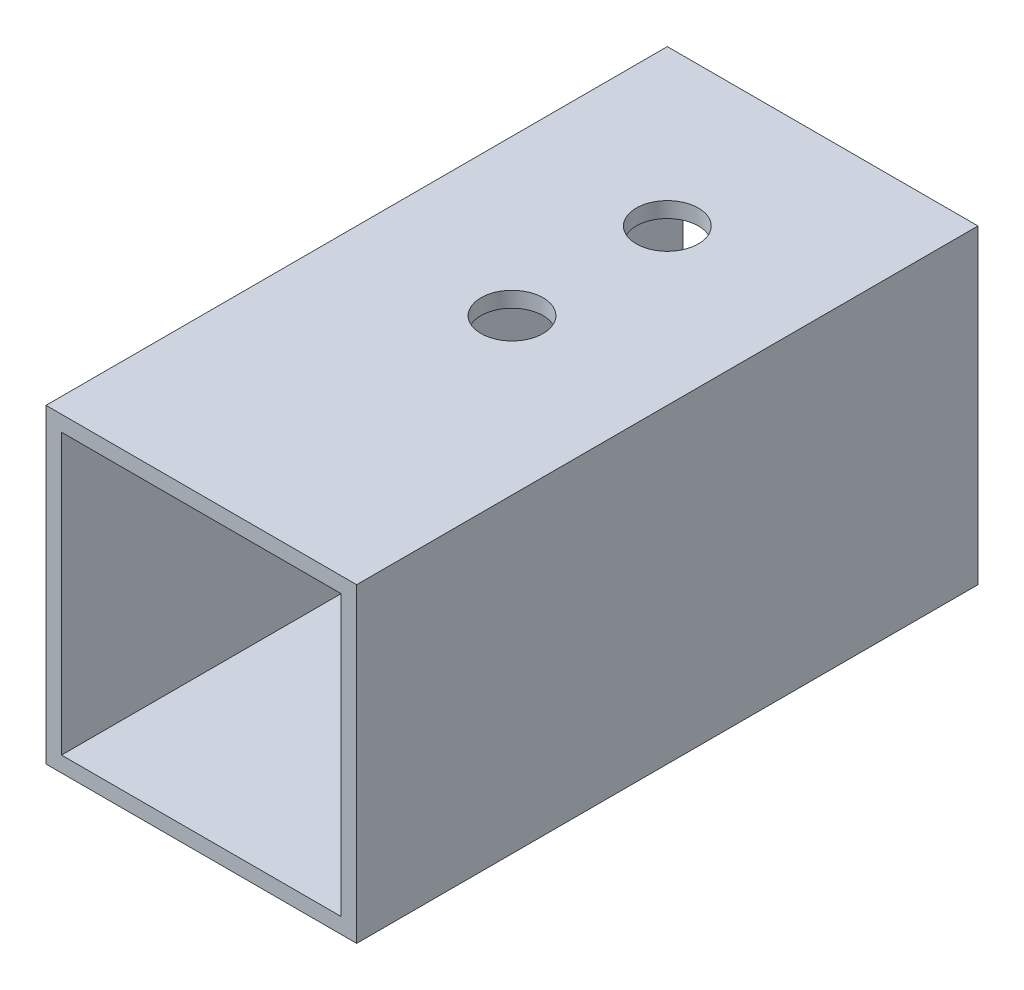
ISO-10303-21;
HEADER;
FILE_DESCRIPTION(('STEP AP214'),'2;1');
FILE_NAME('part.step','',(''),(''),'','','');
FILE_SCHEMA(('AUTOMOTIVE_DESIGN { 1 0 10303 214 1 1 1 1 }'));
ENDSEC;
DATA;
#1=APPLICATION_CONTEXT('core data for automotive mechanical design processes');
#2=APPLICATION_PROTOCOL_DEFINITION('international standard','automotive_design',2000,#1);
#3=PRODUCT_CONTEXT('',#1,'mechanical');
#4=PRODUCT('Part','Part','',(#3));
#5=PRODUCT_RELATED_PRODUCT_CATEGORY('part','',(#4));
#6=PRODUCT_DEFINITION_FORMATION('','',#4);
#7=PRODUCT_DEFINITION_CONTEXT('part definition',#1,'design');
#8=PRODUCT_DEFINITION('design','',#6,#7);
#9=PRODUCT_DEFINITION_SHAPE('','',#8);
#10=(LENGTH_UNIT() NAMED_UNIT(*) SI_UNIT(.MILLI.,.METRE.));
#11=(NAMED_UNIT(*) PLANE_ANGLE_UNIT() SI_UNIT($,.RADIAN.));
#12=(NAMED_UNIT(*) SI_UNIT($,.STERADIAN.) SOLID_ANGLE_UNIT());
#13=UNCERTAINTY_MEASURE_WITH_UNIT(LENGTH_MEASURE(1.E-05),#10,'distance_accuracy_value','');
#14=(GEOMETRIC_REPRESENTATION_CONTEXT(3) GLOBAL_UNCERTAINTY_ASSIGNED_CONTEXT((#13)) GLOBAL_UNIT_ASSIGNED_CONTEXT((#10,
#11,#12)) REPRESENTATION_CONTEXT('',''));
#15=CARTESIAN_POINT('',(0.,0.,0.));
#16=DIRECTION('',(0.,0.,1.));
#17=DIRECTION('',(1.,0.,0.));
#18=AXIS2_PLACEMENT_3D('',#15,#16,#17);
#19=CARTESIAN_POINT('',(0.,0.,80.));
#20=DIRECTION('',(0.,0.,-1.));
#21=DIRECTION('',(-1.,0.,0.));
#22=AXIS2_PLACEMENT_3D('',#19,#20,#21);
#23=PLANE('',#22);
#24=DIRECTION('',(0.,1.,0.));
#25=VECTOR('',#24,1.);
#26=CARTESIAN_POINT('',(20.,-20.,80.));
#27=LINE('',#26,#25);
#28=CARTESIAN_POINT('',(20.,-20.,80.));
#29=VERTEX_POINT('',#28);
#30=CARTESIAN_POINT('',(20.,20.,80.));
#31=VERTEX_POINT('',#30);
#32=EDGE_CURVE('E136',#29,#31,#27,.T.);
#33=ORIENTED_EDGE('',*,*,#32,.T.);
#34=DIRECTION('',(-1.,0.,0.));
#35=VECTOR('',#34,1.);
#36=CARTESIAN_POINT('',(-20.,20.,80.));
#37=LINE('',#36,#35);
#38=CARTESIAN_POINT('',(-20.,20.,80.));
#39=VERTEX_POINT('',#38);
#40=EDGE_CURVE('E139',#31,#39,#37,.T.);
#41=ORIENTED_EDGE('',*,*,#40,.T.);
#42=DIRECTION('',(0.,-1.,0.));
#43=VECTOR('',#42,1.);
#44=CARTESIAN_POINT('',(-20.,-20.,80.));
#45=LINE('',#44,#43);
#46=CARTESIAN_POINT('',(-20.,-20.,80.));
#47=VERTEX_POINT('',#46);
#48=EDGE_CURVE('E142',#39,#47,#45,.T.);
#49=ORIENTED_EDGE('',*,*,#48,.T.);
#50=DIRECTION('',(1.,0.,0.));
#51=VECTOR('',#50,1.);
#52=CARTESIAN_POINT('',(-20.,-20.,80.));
#53=LINE('',#52,#51);
#54=EDGE_CURVE('E144',#47,#29,#53,.T.);
#55=ORIENTED_EDGE('',*,*,#54,.T.);
#56=EDGE_LOOP('',(#33,#41,#49,#55));
#57=FACE_BOUND('',#56,.T.);
#58=DIRECTION('',(0.,1.,0.));
#59=VECTOR('',#58,1.);
#60=CARTESIAN_POINT('',(18.,-18.,80.));
#61=LINE('',#60,#59);
#62=CARTESIAN_POINT('',(18.,-18.,80.));
#63=VERTEX_POINT('',#62);
#64=CARTESIAN_POINT('',(18.,18.,80.));
#65=VERTEX_POINT('',#64);
#66=EDGE_CURVE('E98',#63,#65,#61,.T.);
#67=ORIENTED_EDGE('',*,*,#66,.F.);
#68=DIRECTION('',(1.,0.,0.));
#69=VECTOR('',#68,1.);
#70=CARTESIAN_POINT('',(-18.,-18.,80.));
#71=LINE('',#70,#69);
#72=CARTESIAN_POINT('',(-18.,-18.,80.));
#73=VERTEX_POINT('',#72);
#74=EDGE_CURVE('E120',#73,#63,#71,.T.);
#75=ORIENTED_EDGE('',*,*,#74,.F.);
#76=DIRECTION('',(0.,-1.,0.));
#77=VECTOR('',#76,1.);
#78=CARTESIAN_POINT('',(-18.,-18.,80.));
#79=LINE('',#78,#77);
#80=CARTESIAN_POINT('',(-18.,18.,80.));
#81=VERTEX_POINT('',#80);
#82=EDGE_CURVE('E118',#81,#73,#79,.T.);
#83=ORIENTED_EDGE('',*,*,#82,.F.);
#84=DIRECTION('',(-1.,0.,0.));
#85=VECTOR('',#84,1.);
#86=CARTESIAN_POINT('',(-18.,18.,80.));
#87=LINE('',#86,#85);
#88=EDGE_CURVE('E106',#65,#81,#87,.T.);
#89=ORIENTED_EDGE('',*,*,#88,.F.);
#90=EDGE_LOOP('',(#67,#75,#83,#89));
#91=FACE_BOUND('',#90,.T.);
#92=ADVANCED_FACE('F33',(#57,#91),#23,.F.);
#93=CARTESIAN_POINT('',(0.,0.,0.));
#94=DIRECTION('',(0.,0.,-1.));
#95=DIRECTION('',(-1.,0.,0.));
#96=AXIS2_PLACEMENT_3D('',#93,#94,#95);
#97=PLANE('',#96);
#98=DIRECTION('',(0.,1.,0.));
#99=VECTOR('',#98,1.);
#100=CARTESIAN_POINT('',(20.,-20.,0.));
#101=LINE('',#100,#99);
#102=CARTESIAN_POINT('',(20.,-20.,0.));
#103=VERTEX_POINT('',#102);
#104=CARTESIAN_POINT('',(20.,20.,0.));
#105=VERTEX_POINT('',#104);
#106=EDGE_CURVE('E114',#103,#105,#101,.T.);
#107=ORIENTED_EDGE('',*,*,#106,.F.);
#108=DIRECTION('',(1.,0.,0.));
#109=VECTOR('',#108,1.);
#110=CARTESIAN_POINT('',(-20.,-20.,0.));
#111=LINE('',#110,#109);
#112=CARTESIAN_POINT('',(-20.,-20.,0.));
#113=VERTEX_POINT('',#112);
#114=EDGE_CURVE('E140',#113,#103,#111,.T.);
#115=ORIENTED_EDGE('',*,*,#114,.F.);
#116=DIRECTION('',(0.,-1.,0.));
#117=VECTOR('',#116,1.);
#118=CARTESIAN_POINT('',(-20.,-20.,0.));
#119=LINE('',#118,#117);
#120=CARTESIAN_POINT('',(-20.,20.,0.));
#121=VERTEX_POINT('',#120);
#122=EDGE_CURVE('E151',#121,#113,#119,.T.);
#123=ORIENTED_EDGE('',*,*,#122,.F.);
#124=DIRECTION('',(-1.,0.,0.));
#125=VECTOR('',#124,1.);
#126=CARTESIAN_POINT('',(-20.,20.,0.));
#127=LINE('',#126,#125);
#128=EDGE_CURVE('E149',#105,#121,#127,.T.);
#129=ORIENTED_EDGE('',*,*,#128,.F.);
#130=EDGE_LOOP('',(#107,#115,#123,#129));
#131=FACE_BOUND('',#130,.T.);
#132=DIRECTION('',(1.,0.,0.));
#133=VECTOR('',#132,1.);
#134=CARTESIAN_POINT('',(-18.,-18.,0.));
#135=LINE('',#134,#133);
#136=CARTESIAN_POINT('',(-18.,-18.,0.));
#137=VERTEX_POINT('',#136);
#138=CARTESIAN_POINT('',(18.,-18.,0.));
#139=VERTEX_POINT('',#138);
#140=EDGE_CURVE('E107',#137,#139,#135,.T.);
#141=ORIENTED_EDGE('',*,*,#140,.T.);
#142=DIRECTION('',(0.,1.,0.));
#143=VECTOR('',#142,1.);
#144=CARTESIAN_POINT('',(18.,-18.,0.));
#145=LINE('',#144,#143);
#146=CARTESIAN_POINT('',(18.,18.,0.));
#147=VERTEX_POINT('',#146);
#148=EDGE_CURVE('E56',#139,#147,#145,.T.);
#149=ORIENTED_EDGE('',*,*,#148,.T.);
#150=DIRECTION('',(-1.,0.,0.));
#151=VECTOR('',#150,1.);
#152=CARTESIAN_POINT('',(-18.,18.,0.));
#153=LINE('',#152,#151);
#154=CARTESIAN_POINT('',(-18.,18.,0.));
#155=VERTEX_POINT('',#154);
#156=EDGE_CURVE('E113',#147,#155,#153,.T.);
#157=ORIENTED_EDGE('',*,*,#156,.T.);
#158=DIRECTION('',(0.,-1.,0.));
#159=VECTOR('',#158,1.);
#160=CARTESIAN_POINT('',(-18.,-18.,0.));
#161=LINE('',#160,#159);
#162=EDGE_CURVE('E128',#155,#137,#161,.T.);
#163=ORIENTED_EDGE('',*,*,#162,.T.);
#164=EDGE_LOOP('',(#141,#149,#157,#163));
#165=FACE_BOUND('',#164,.T.);
#166=ADVANCED_FACE('F169',(#131,#165),#97,.T.);
#167=CARTESIAN_POINT('',(20.,-20.,80.));
#168=DIRECTION('',(-1.,0.,0.));
#169=DIRECTION('',(0.,0.,1.));
#170=AXIS2_PLACEMENT_3D('',#167,#168,#169);
#171=PLANE('',#170);
#172=ORIENTED_EDGE('',*,*,#106,.T.);
#173=DIRECTION('',(0.,0.,-1.));
#174=VECTOR('',#173,1.);
#175=CARTESIAN_POINT('',(20.,20.,80.));
#176=LINE('',#175,#174);
#177=EDGE_CURVE('E11',#31,#105,#176,.T.);
#178=ORIENTED_EDGE('',*,*,#177,.F.);
#179=ORIENTED_EDGE('',*,*,#32,.F.);
#180=DIRECTION('',(0.,0.,-1.));
#181=VECTOR('',#180,1.);
#182=CARTESIAN_POINT('',(20.,-20.,80.));
#183=LINE('',#182,#181);
#184=EDGE_CURVE('E146',#29,#103,#183,.T.);
#185=ORIENTED_EDGE('',*,*,#184,.T.);
#186=EDGE_LOOP('',(#172,#178,#179,#185));
#187=FACE_BOUND('',#186,.T.);
#188=ADVANCED_FACE('F35',(#187),#171,.F.);
#189=CARTESIAN_POINT('',(-20.,20.,80.));
#190=DIRECTION('',(0.,-1.,0.));
#191=DIRECTION('',(0.,0.,-1.));
#192=AXIS2_PLACEMENT_3D('',#189,#190,#191);
#193=PLANE('',#192);
#194=CARTESIAN_POINT('',(0.,20.,20.));
#195=DIRECTION('',(0.,1.,0.));
#196=DIRECTION('',(0.,0.,1.));
#197=AXIS2_PLACEMENT_3D('',#194,#195,#196);
#198=CIRCLE('',#197,4.);
#199=CARTESIAN_POINT('',(0.,20.,24.));
#200=VERTEX_POINT('',#199);
#201=EDGE_CURVE('E126',#200,#200,#198,.T.);
#202=ORIENTED_EDGE('',*,*,#201,.F.);
#203=EDGE_LOOP('',(#202));
#204=FACE_BOUND('',#203,.T.);
#205=CARTESIAN_POINT('',(0.,20.,40.));
#206=DIRECTION('',(0.,1.,0.));
#207=DIRECTION('',(0.,0.,1.));
#208=AXIS2_PLACEMENT_3D('',#205,#206,#207);
#209=CIRCLE('',#208,4.);
#210=CARTESIAN_POINT('',(0.,20.,44.));
#211=VERTEX_POINT('',#210);
#212=EDGE_CURVE('E211',#211,#211,#209,.T.);
#213=ORIENTED_EDGE('',*,*,#212,.F.);
#214=EDGE_LOOP('',(#213));
#215=FACE_BOUND('',#214,.T.);
#216=ORIENTED_EDGE('',*,*,#128,.T.);
#217=DIRECTION('',(0.,0.,-1.));
#218=VECTOR('',#217,1.);
#219=CARTESIAN_POINT('',(-20.,20.,80.));
#220=LINE('',#219,#218);
#221=EDGE_CURVE('E41',#39,#121,#220,.T.);
#222=ORIENTED_EDGE('',*,*,#221,.F.);
#223=ORIENTED_EDGE('',*,*,#40,.F.);
#224=ORIENTED_EDGE('',*,*,#177,.T.);
#225=EDGE_LOOP('',(#216,#222,#223,#224));
#226=FACE_BOUND('',#225,.T.);
#227=ADVANCED_FACE('F179',(#204,#215,#226),#193,.F.);
#228=CARTESIAN_POINT('',(-20.,-20.,80.));
#229=DIRECTION('',(1.,0.,0.));
#230=DIRECTION('',(0.,0.,-1.));
#231=AXIS2_PLACEMENT_3D('',#228,#229,#230);
#232=PLANE('',#231);
#233=ORIENTED_EDGE('',*,*,#122,.T.);
#234=DIRECTION('',(0.,0.,-1.));
#235=VECTOR('',#234,1.);
#236=CARTESIAN_POINT('',(-20.,-20.,80.));
#237=LINE('',#236,#235);
#238=EDGE_CURVE('E156',#47,#113,#237,.T.);
#239=ORIENTED_EDGE('',*,*,#238,.F.);
#240=ORIENTED_EDGE('',*,*,#48,.F.);
#241=ORIENTED_EDGE('',*,*,#221,.T.);
#242=EDGE_LOOP('',(#233,#239,#240,#241));
#243=FACE_BOUND('',#242,.T.);
#244=ADVANCED_FACE('F163',(#243),#232,.F.);
#245=CARTESIAN_POINT('',(-20.,-20.,80.));
#246=DIRECTION('',(0.,1.,0.));
#247=DIRECTION('',(0.,0.,1.));
#248=AXIS2_PLACEMENT_3D('',#245,#246,#247);
#249=PLANE('',#248);
#250=CARTESIAN_POINT('',(0.,-20.,20.));
#251=DIRECTION('',(0.,-1.,0.));
#252=DIRECTION('',(0.,0.,-1.));
#253=AXIS2_PLACEMENT_3D('',#250,#251,#252);
#254=CIRCLE('',#253,4.);
#255=CARTESIAN_POINT('',(0.,-20.,16.));
#256=VERTEX_POINT('',#255);
#257=EDGE_CURVE('E205',#256,#256,#254,.T.);
#258=ORIENTED_EDGE('',*,*,#257,.F.);
#259=EDGE_LOOP('',(#258));
#260=FACE_BOUND('',#259,.T.);
#261=ORIENTED_EDGE('',*,*,#114,.T.);
#262=ORIENTED_EDGE('',*,*,#184,.F.);
#263=ORIENTED_EDGE('',*,*,#54,.F.);
#264=ORIENTED_EDGE('',*,*,#238,.T.);
#265=EDGE_LOOP('',(#261,#262,#263,#264));
#266=FACE_BOUND('',#265,.T.);
#267=ADVANCED_FACE('F173',(#260,#266),#249,.F.);
#268=CARTESIAN_POINT('',(18.,-18.,80.));
#269=DIRECTION('',(-1.,0.,0.));
#270=DIRECTION('',(0.,0.,1.));
#271=AXIS2_PLACEMENT_3D('',#268,#269,#270);
#272=PLANE('',#271);
#273=ORIENTED_EDGE('',*,*,#148,.F.);
#274=DIRECTION('',(0.,0.,-1.));
#275=VECTOR('',#274,1.);
#276=CARTESIAN_POINT('',(18.,-18.,80.));
#277=LINE('',#276,#275);
#278=EDGE_CURVE('E102',#63,#139,#277,.T.);
#279=ORIENTED_EDGE('',*,*,#278,.F.);
#280=ORIENTED_EDGE('',*,*,#66,.T.);
#281=DIRECTION('',(0.,0.,-1.));
#282=VECTOR('',#281,1.);
#283=CARTESIAN_POINT('',(18.,18.,80.));
#284=LINE('',#283,#282);
#285=EDGE_CURVE('E101',#65,#147,#284,.T.);
#286=ORIENTED_EDGE('',*,*,#285,.T.);
#287=EDGE_LOOP('',(#273,#279,#280,#286));
#288=FACE_BOUND('',#287,.T.);
#289=ADVANCED_FACE('F100',(#288),#272,.T.);
#290=CARTESIAN_POINT('',(-18.,18.,80.));
#291=DIRECTION('',(0.,-1.,0.));
#292=DIRECTION('',(0.,0.,-1.));
#293=AXIS2_PLACEMENT_3D('',#290,#291,#292);
#294=PLANE('',#293);
#295=CARTESIAN_POINT('',(0.,18.,20.));
#296=DIRECTION('',(0.,-1.,0.));
#297=DIRECTION('',(0.,0.,-1.));
#298=AXIS2_PLACEMENT_3D('',#295,#296,#297);
#299=CIRCLE('',#298,4.);
#300=CARTESIAN_POINT('',(0.,18.,16.));
#301=VERTEX_POINT('',#300);
#302=EDGE_CURVE('E216',#301,#301,#299,.F.);
#303=ORIENTED_EDGE('',*,*,#302,.T.);
#304=EDGE_LOOP('',(#303));
#305=FACE_BOUND('',#304,.T.);
#306=CARTESIAN_POINT('',(0.,18.,40.));
#307=DIRECTION('',(0.,-1.,0.));
#308=DIRECTION('',(0.,0.,-1.));
#309=AXIS2_PLACEMENT_3D('',#306,#307,#308);
#310=CIRCLE('',#309,4.);
#311=CARTESIAN_POINT('',(0.,18.,36.));
#312=VERTEX_POINT('',#311);
#313=EDGE_CURVE('E207',#312,#312,#310,.F.);
#314=ORIENTED_EDGE('',*,*,#313,.T.);
#315=EDGE_LOOP('',(#314));
#316=FACE_BOUND('',#315,.T.);
#317=ORIENTED_EDGE('',*,*,#156,.F.);
#318=ORIENTED_EDGE('',*,*,#285,.F.);
#319=ORIENTED_EDGE('',*,*,#88,.T.);
#320=DIRECTION('',(0.,0.,-1.));
#321=VECTOR('',#320,1.);
#322=CARTESIAN_POINT('',(-18.,18.,80.));
#323=LINE('',#322,#321);
#324=EDGE_CURVE('E115',#81,#155,#323,.T.);
#325=ORIENTED_EDGE('',*,*,#324,.T.);
#326=EDGE_LOOP('',(#317,#318,#319,#325));
#327=FACE_BOUND('',#326,.T.);
#328=ADVANCED_FACE('F110',(#305,#316,#327),#294,.T.);
#329=CARTESIAN_POINT('',(-18.,-18.,80.));
#330=DIRECTION('',(1.,0.,0.));
#331=DIRECTION('',(0.,0.,-1.));
#332=AXIS2_PLACEMENT_3D('',#329,#330,#331);
#333=PLANE('',#332);
#334=ORIENTED_EDGE('',*,*,#162,.F.);
#335=ORIENTED_EDGE('',*,*,#324,.F.);
#336=ORIENTED_EDGE('',*,*,#82,.T.);
#337=DIRECTION('',(0.,0.,-1.));
#338=VECTOR('',#337,1.);
#339=CARTESIAN_POINT('',(-18.,-18.,80.));
#340=LINE('',#339,#338);
#341=EDGE_CURVE('E48',#73,#137,#340,.T.);
#342=ORIENTED_EDGE('',*,*,#341,.T.);
#343=EDGE_LOOP('',(#334,#335,#336,#342));
#344=FACE_BOUND('',#343,.T.);
#345=ADVANCED_FACE('F236',(#344),#333,.T.);
#346=CARTESIAN_POINT('',(-18.,-18.,80.));
#347=DIRECTION('',(0.,1.,0.));
#348=DIRECTION('',(0.,0.,1.));
#349=AXIS2_PLACEMENT_3D('',#346,#347,#348);
#350=PLANE('',#349);
#351=CARTESIAN_POINT('',(0.,-18.,20.));
#352=DIRECTION('',(0.,1.,0.));
#353=DIRECTION('',(0.,0.,1.));
#354=AXIS2_PLACEMENT_3D('',#351,#352,#353);
#355=CIRCLE('',#354,4.);
#356=CARTESIAN_POINT('',(0.,-18.,24.));
#357=VERTEX_POINT('',#356);
#358=EDGE_CURVE('E208',#357,#357,#355,.F.);
#359=ORIENTED_EDGE('',*,*,#358,.T.);
#360=EDGE_LOOP('',(#359));
#361=FACE_BOUND('',#360,.T.);
#362=ORIENTED_EDGE('',*,*,#140,.F.);
#363=ORIENTED_EDGE('',*,*,#341,.F.);
#364=ORIENTED_EDGE('',*,*,#74,.T.);
#365=ORIENTED_EDGE('',*,*,#278,.T.);
#366=EDGE_LOOP('',(#362,#363,#364,#365));
#367=FACE_BOUND('',#366,.T.);
#368=ADVANCED_FACE('F226',(#361,#367),#350,.T.);
#369=CARTESIAN_POINT('',(0.,-20.001,40.));
#370=DIRECTION('',(0.,1.,0.));
#371=DIRECTION('',(0.,0.,1.));
#372=AXIS2_PLACEMENT_3D('',#369,#370,#371);
#373=CYLINDRICAL_SURFACE('',#372,4.);
#374=ORIENTED_EDGE('',*,*,#313,.F.);
#375=EDGE_LOOP('',(#374));
#376=FACE_BOUND('',#375,.T.);
#377=ORIENTED_EDGE('',*,*,#212,.T.);
#378=EDGE_LOOP('',(#377));
#379=FACE_BOUND('',#378,.T.);
#380=ADVANCED_FACE('F223',(#376,#379),#373,.F.);
#381=CARTESIAN_POINT('',(0.,-20.001,20.));
#382=DIRECTION('',(0.,1.,0.));
#383=DIRECTION('',(0.,0.,1.));
#384=AXIS2_PLACEMENT_3D('',#381,#382,#383);
#385=CYLINDRICAL_SURFACE('',#384,4.);
#386=ORIENTED_EDGE('',*,*,#302,.F.);
#387=EDGE_LOOP('',(#386));
#388=FACE_BOUND('',#387,.T.);
#389=ORIENTED_EDGE('',*,*,#201,.T.);
#390=EDGE_LOOP('',(#389));
#391=FACE_BOUND('',#390,.T.);
#392=ADVANCED_FACE('F225',(#388,#391),#385,.F.);
#393=CARTESIAN_POINT('',(0.,20.001,20.));
#394=DIRECTION('',(0.,-1.,0.));
#395=DIRECTION('',(0.,0.,-1.));
#396=AXIS2_PLACEMENT_3D('',#393,#394,#395);
#397=CYLINDRICAL_SURFACE('',#396,4.);
#398=ORIENTED_EDGE('',*,*,#358,.F.);
#399=EDGE_LOOP('',(#398));
#400=FACE_BOUND('',#399,.T.);
#401=ORIENTED_EDGE('',*,*,#257,.T.);
#402=EDGE_LOOP('',(#401));
#403=FACE_BOUND('',#402,.T.);
#404=ADVANCED_FACE('F233',(#400,#403),#397,.F.);
#405=CLOSED_SHELL('',(#92,#166,#188,#227,#244,#267,#289,#328,#345,#368,#380,#392,#404));
#406=MANIFOLD_SOLID_BREP('B2',#405);
#407=ADVANCED_BREP_SHAPE_REPRESENTATION('',(#18,#406),#14);
#408=SHAPE_DEFINITION_REPRESENTATION(#9,#407);
ENDSEC;
END-ISO-10303-21;
